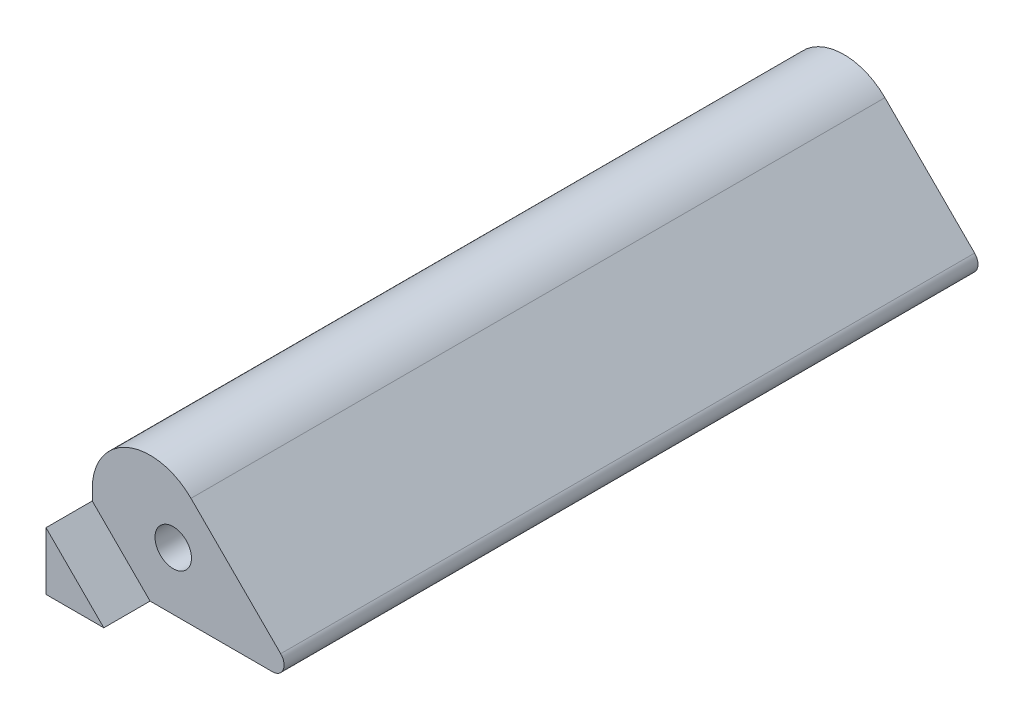
ISO-10303-21;
HEADER;
FILE_DESCRIPTION(('STEP AP214'),'2;1');
FILE_NAME('part.step','',(''),(''),'','','');
FILE_SCHEMA(('AUTOMOTIVE_DESIGN { 1 0 10303 214 1 1 1 1 }'));
ENDSEC;
DATA;
#1=APPLICATION_CONTEXT('core data for automotive mechanical design processes');
#2=APPLICATION_PROTOCOL_DEFINITION('international standard','automotive_design',2000,#1);
#3=PRODUCT_CONTEXT('',#1,'mechanical');
#4=PRODUCT('Part','Part','',(#3));
#5=PRODUCT_RELATED_PRODUCT_CATEGORY('part','',(#4));
#6=PRODUCT_DEFINITION_FORMATION('','',#4);
#7=PRODUCT_DEFINITION_CONTEXT('part definition',#1,'design');
#8=PRODUCT_DEFINITION('design','',#6,#7);
#9=PRODUCT_DEFINITION_SHAPE('','',#8);
#10=(LENGTH_UNIT() NAMED_UNIT(*) SI_UNIT(.MILLI.,.METRE.));
#11=(NAMED_UNIT(*) PLANE_ANGLE_UNIT() SI_UNIT($,.RADIAN.));
#12=(NAMED_UNIT(*) SI_UNIT($,.STERADIAN.) SOLID_ANGLE_UNIT());
#13=UNCERTAINTY_MEASURE_WITH_UNIT(LENGTH_MEASURE(1.E-05),#10,'distance_accuracy_value','');
#14=(GEOMETRIC_REPRESENTATION_CONTEXT(3) GLOBAL_UNCERTAINTY_ASSIGNED_CONTEXT((#13)) GLOBAL_UNIT_ASSIGNED_CONTEXT((#10,
#11,#12)) REPRESENTATION_CONTEXT('',''));
#15=CARTESIAN_POINT('',(0.,0.,0.));
#16=DIRECTION('',(0.,0.,1.));
#17=DIRECTION('',(1.,0.,0.));
#18=AXIS2_PLACEMENT_3D('',#15,#16,#17);
#19=CARTESIAN_POINT('',(0.,0.,0.));
#20=DIRECTION('',(0.,0.,1.));
#21=DIRECTION('',(1.,0.,0.));
#22=AXIS2_PLACEMENT_3D('',#19,#20,#21);
#23=PLANE('',#22);
#24=CARTESIAN_POINT('',(7.,5.,0.));
#25=DIRECTION('',(0.,0.,-1.));
#26=DIRECTION('',(-1.,0.,0.));
#27=AXIS2_PLACEMENT_3D('',#24,#25,#26);
#28=CIRCLE('',#27,1.57499999999999);
#29=CARTESIAN_POINT('',(5.42500000000001,5.,0.));
#30=VERTEX_POINT('',#29);
#31=EDGE_CURVE('E127',#30,#30,#28,.T.);
#32=ORIENTED_EDGE('',*,*,#31,.F.);
#33=EDGE_LOOP('',(#32));
#34=FACE_BOUND('',#33,.T.);
#35=DIRECTION('',(0.,-1.,0.));
#36=VECTOR('',#35,1.);
#37=CARTESIAN_POINT('',(0.,17.9999999999998,0.));
#38=LINE('',#37,#36);
#39=CARTESIAN_POINT('',(0.,5.92893218813442,0.));
#40=VERTEX_POINT('',#39);
#41=CARTESIAN_POINT('',(0.,5.,0.));
#42=VERTEX_POINT('',#41);
#43=EDGE_CURVE('E170',#40,#42,#38,.T.);
#44=ORIENTED_EDGE('',*,*,#43,.F.);
#45=CARTESIAN_POINT('',(5.,5.92893218813442,0.));
#46=DIRECTION('',(0.,0.,1.));
#47=DIRECTION('',(1.,0.,0.));
#48=AXIS2_PLACEMENT_3D('',#45,#46,#47);
#49=CIRCLE('',#48,5.);
#50=CARTESIAN_POINT('',(8.53553390593272,9.46446609406718,0.));
#51=VERTEX_POINT('',#50);
#52=EDGE_CURVE('E63',#40,#51,#49,.F.);
#53=ORIENTED_EDGE('',*,*,#52,.T.);
#54=DIRECTION('',(-0.707106781186551,0.707106781186544,0.));
#55=VECTOR('',#54,1.);
#56=CARTESIAN_POINT('',(18.,0.,0.));
#57=LINE('',#56,#55);
#58=CARTESIAN_POINT('',(16.2928932188134,1.70710678118655,0.));
#59=VERTEX_POINT('',#58);
#60=EDGE_CURVE('E174',#59,#51,#57,.T.);
#61=ORIENTED_EDGE('',*,*,#60,.F.);
#62=CARTESIAN_POINT('',(15.5857864376269,1.,0.));
#63=DIRECTION('',(0.,0.,1.));
#64=DIRECTION('',(1.,0.,0.));
#65=AXIS2_PLACEMENT_3D('',#62,#63,#64);
#66=CIRCLE('',#65,1.);
#67=CARTESIAN_POINT('',(15.5857864376269,0.,0.));
#68=VERTEX_POINT('',#67);
#69=EDGE_CURVE('E189',#59,#68,#66,.F.);
#70=ORIENTED_EDGE('',*,*,#69,.T.);
#71=DIRECTION('',(1.,0.,0.));
#72=VECTOR('',#71,1.);
#73=CARTESIAN_POINT('',(0.,0.,0.));
#74=LINE('',#73,#72);
#75=CARTESIAN_POINT('',(5.,0.,0.));
#76=VERTEX_POINT('',#75);
#77=EDGE_CURVE('E181',#76,#68,#74,.T.);
#78=ORIENTED_EDGE('',*,*,#77,.F.);
#79=DIRECTION('',(0.707106781186547,-0.707106781186548,0.));
#80=VECTOR('',#79,1.);
#81=CARTESIAN_POINT('',(0.,5.,0.));
#82=LINE('',#81,#80);
#83=EDGE_CURVE('E137',#42,#76,#82,.T.);
#84=ORIENTED_EDGE('',*,*,#83,.F.);
#85=EDGE_LOOP('',(#44,#53,#61,#70,#78,#84));
#86=FACE_BOUND('',#85,.T.);
#87=ADVANCED_FACE('F41',(#34,#86),#23,.F.);
#88=CARTESIAN_POINT('',(0.,17.9999999999998,60.));
#89=DIRECTION('',(1.,0.,0.));
#90=DIRECTION('',(0.,0.,-1.));
#91=AXIS2_PLACEMENT_3D('',#88,#89,#90);
#92=PLANE('',#91);
#93=DIRECTION('',(0.,-1.,0.));
#94=VECTOR('',#93,1.);
#95=CARTESIAN_POINT('',(0.,17.9999999999998,60.));
#96=LINE('',#95,#94);
#97=CARTESIAN_POINT('',(0.,5.92893218813442,60.));
#98=VERTEX_POINT('',#97);
#99=CARTESIAN_POINT('',(0.,5.,60.));
#100=VERTEX_POINT('',#99);
#101=EDGE_CURVE('E171',#98,#100,#96,.T.);
#102=ORIENTED_EDGE('',*,*,#101,.F.);
#103=DIRECTION('',(0.,0.,-1.));
#104=VECTOR('',#103,1.);
#105=CARTESIAN_POINT('',(0.,5.92893218813442,60.));
#106=LINE('',#105,#104);
#107=EDGE_CURVE('E195',#98,#40,#106,.T.);
#108=ORIENTED_EDGE('',*,*,#107,.T.);
#109=ORIENTED_EDGE('',*,*,#43,.T.);
#110=DIRECTION('',(0.,0.,1.));
#111=VECTOR('',#110,1.);
#112=CARTESIAN_POINT('',(0.,5.,-4.));
#113=LINE('',#112,#111);
#114=CARTESIAN_POINT('',(0.,5.,-4.));
#115=VERTEX_POINT('',#114);
#116=EDGE_CURVE('E150',#115,#42,#113,.T.);
#117=ORIENTED_EDGE('',*,*,#116,.F.);
#118=DIRECTION('',(0.,1.,0.));
#119=VECTOR('',#118,1.);
#120=CARTESIAN_POINT('',(0.,0.,-4.));
#121=LINE('',#120,#119);
#122=CARTESIAN_POINT('',(0.,0.,-4.));
#123=VERTEX_POINT('',#122);
#124=EDGE_CURVE('E141',#123,#115,#121,.T.);
#125=ORIENTED_EDGE('',*,*,#124,.F.);
#126=DIRECTION('',(0.,0.,-1.));
#127=VECTOR('',#126,1.);
#128=CARTESIAN_POINT('',(0.,0.,60.));
#129=LINE('',#128,#127);
#130=CARTESIAN_POINT('',(0.,0.,64.));
#131=VERTEX_POINT('',#130);
#132=EDGE_CURVE('E179',#131,#123,#129,.T.);
#133=ORIENTED_EDGE('',*,*,#132,.F.);
#134=DIRECTION('',(0.,-1.,0.));
#135=VECTOR('',#134,1.);
#136=CARTESIAN_POINT('',(0.,0.,64.));
#137=LINE('',#136,#135);
#138=CARTESIAN_POINT('',(0.,5.,64.));
#139=VERTEX_POINT('',#138);
#140=EDGE_CURVE('E159',#139,#131,#137,.T.);
#141=ORIENTED_EDGE('',*,*,#140,.F.);
#142=DIRECTION('',(0.,0.,-1.));
#143=VECTOR('',#142,1.);
#144=CARTESIAN_POINT('',(0.,5.,64.));
#145=LINE('',#144,#143);
#146=EDGE_CURVE('E162',#139,#100,#145,.T.);
#147=ORIENTED_EDGE('',*,*,#146,.T.);
#148=EDGE_LOOP('',(#102,#108,#109,#117,#125,#133,#141,#147));
#149=FACE_BOUND('',#148,.T.);
#150=ADVANCED_FACE('F201',(#149),#92,.F.);
#151=CARTESIAN_POINT('',(0.,0.,60.));
#152=DIRECTION('',(0.,1.,0.));
#153=DIRECTION('',(0.,0.,1.));
#154=AXIS2_PLACEMENT_3D('',#151,#152,#153);
#155=PLANE('',#154);
#156=ORIENTED_EDGE('',*,*,#77,.T.);
#157=DIRECTION('',(0.,0.,-1.));
#158=VECTOR('',#157,1.);
#159=CARTESIAN_POINT('',(15.5857864376269,0.,60.));
#160=LINE('',#159,#158);
#161=CARTESIAN_POINT('',(15.5857864376269,0.,60.));
#162=VERTEX_POINT('',#161);
#163=EDGE_CURVE('E191',#68,#162,#160,.F.);
#164=ORIENTED_EDGE('',*,*,#163,.T.);
#165=DIRECTION('',(1.,0.,0.));
#166=VECTOR('',#165,1.);
#167=CARTESIAN_POINT('',(0.,0.,60.));
#168=LINE('',#167,#166);
#169=CARTESIAN_POINT('',(5.,0.,60.));
#170=VERTEX_POINT('',#169);
#171=EDGE_CURVE('E173',#170,#162,#168,.T.);
#172=ORIENTED_EDGE('',*,*,#171,.F.);
#173=DIRECTION('',(0.,0.,-1.));
#174=VECTOR('',#173,1.);
#175=CARTESIAN_POINT('',(5.,0.,64.));
#176=LINE('',#175,#174);
#177=CARTESIAN_POINT('',(5.,0.,64.));
#178=VERTEX_POINT('',#177);
#179=EDGE_CURVE('E167',#178,#170,#176,.T.);
#180=ORIENTED_EDGE('',*,*,#179,.F.);
#181=DIRECTION('',(1.,0.,0.));
#182=VECTOR('',#181,1.);
#183=CARTESIAN_POINT('',(5.,0.,64.));
#184=LINE('',#183,#182);
#185=EDGE_CURVE('E154',#131,#178,#184,.T.);
#186=ORIENTED_EDGE('',*,*,#185,.F.);
#187=ORIENTED_EDGE('',*,*,#132,.T.);
#188=DIRECTION('',(-1.,0.,0.));
#189=VECTOR('',#188,1.);
#190=CARTESIAN_POINT('',(5.,0.,-4.));
#191=LINE('',#190,#189);
#192=CARTESIAN_POINT('',(5.,0.,-4.));
#193=VERTEX_POINT('',#192);
#194=EDGE_CURVE('E138',#193,#123,#191,.T.);
#195=ORIENTED_EDGE('',*,*,#194,.F.);
#196=DIRECTION('',(0.,0.,1.));
#197=VECTOR('',#196,1.);
#198=CARTESIAN_POINT('',(5.,0.,-4.));
#199=LINE('',#198,#197);
#200=EDGE_CURVE('E145',#193,#76,#199,.T.);
#201=ORIENTED_EDGE('',*,*,#200,.T.);
#202=EDGE_LOOP('',(#156,#164,#172,#180,#186,#187,#195,#201));
#203=FACE_BOUND('',#202,.T.);
#204=ADVANCED_FACE('F216',(#203),#155,.F.);
#205=CARTESIAN_POINT('',(18.,0.,60.));
#206=DIRECTION('',(-0.707106781186544,-0.707106781186551,0.));
#207=DIRECTION('',(0.707106781186551,-0.707106781186544,0.));
#208=AXIS2_PLACEMENT_3D('',#205,#206,#207);
#209=PLANE('',#208);
#210=ORIENTED_EDGE('',*,*,#60,.T.);
#211=DIRECTION('',(0.,0.,-1.));
#212=VECTOR('',#211,1.);
#213=CARTESIAN_POINT('',(8.53553390593272,9.46446609406718,60.));
#214=LINE('',#213,#212);
#215=CARTESIAN_POINT('',(8.53553390593272,9.46446609406718,60.));
#216=VERTEX_POINT('',#215);
#217=EDGE_CURVE('E49',#51,#216,#214,.F.);
#218=ORIENTED_EDGE('',*,*,#217,.T.);
#219=DIRECTION('',(-0.707106781186551,0.707106781186544,0.));
#220=VECTOR('',#219,1.);
#221=CARTESIAN_POINT('',(18.,0.,60.));
#222=LINE('',#221,#220);
#223=CARTESIAN_POINT('',(16.2928932188134,1.70710678118655,60.));
#224=VERTEX_POINT('',#223);
#225=EDGE_CURVE('E177',#224,#216,#222,.T.);
#226=ORIENTED_EDGE('',*,*,#225,.F.);
#227=DIRECTION('',(0.,0.,-1.));
#228=VECTOR('',#227,1.);
#229=CARTESIAN_POINT('',(16.2928932188134,1.70710678118655,60.));
#230=LINE('',#229,#228);
#231=EDGE_CURVE('E186',#224,#59,#230,.T.);
#232=ORIENTED_EDGE('',*,*,#231,.T.);
#233=EDGE_LOOP('',(#210,#218,#226,#232));
#234=FACE_BOUND('',#233,.T.);
#235=ADVANCED_FACE('F232',(#234),#209,.F.);
#236=CARTESIAN_POINT('',(0.,0.,60.));
#237=DIRECTION('',(0.,0.,1.));
#238=DIRECTION('',(1.,0.,0.));
#239=AXIS2_PLACEMENT_3D('',#236,#237,#238);
#240=PLANE('',#239);
#241=CARTESIAN_POINT('',(7.,5.,60.));
#242=DIRECTION('',(0.,0.,1.));
#243=DIRECTION('',(1.,0.,0.));
#244=AXIS2_PLACEMENT_3D('',#241,#242,#243);
#245=CIRCLE('',#244,1.57499999999999);
#246=CARTESIAN_POINT('',(8.57499999999999,5.,60.));
#247=VERTEX_POINT('',#246);
#248=EDGE_CURVE('E126',#247,#247,#245,.T.);
#249=ORIENTED_EDGE('',*,*,#248,.F.);
#250=EDGE_LOOP('',(#249));
#251=FACE_BOUND('',#250,.T.);
#252=ORIENTED_EDGE('',*,*,#225,.T.);
#253=CARTESIAN_POINT('',(5.,5.92893218813442,60.));
#254=DIRECTION('',(0.,0.,1.));
#255=DIRECTION('',(1.,0.,0.));
#256=AXIS2_PLACEMENT_3D('',#253,#254,#255);
#257=CIRCLE('',#256,5.);
#258=EDGE_CURVE('E11',#216,#98,#257,.T.);
#259=ORIENTED_EDGE('',*,*,#258,.T.);
#260=ORIENTED_EDGE('',*,*,#101,.T.);
#261=DIRECTION('',(-0.707106781186548,0.707106781186547,0.));
#262=VECTOR('',#261,1.);
#263=CARTESIAN_POINT('',(0.,5.,60.));
#264=LINE('',#263,#262);
#265=EDGE_CURVE('E153',#170,#100,#264,.T.);
#266=ORIENTED_EDGE('',*,*,#265,.F.);
#267=ORIENTED_EDGE('',*,*,#171,.T.);
#268=CARTESIAN_POINT('',(15.5857864376269,1.,60.));
#269=DIRECTION('',(0.,0.,1.));
#270=DIRECTION('',(1.,0.,0.));
#271=AXIS2_PLACEMENT_3D('',#268,#269,#270);
#272=CIRCLE('',#271,1.);
#273=EDGE_CURVE('E193',#162,#224,#272,.T.);
#274=ORIENTED_EDGE('',*,*,#273,.T.);
#275=EDGE_LOOP('',(#252,#259,#260,#266,#267,#274));
#276=FACE_BOUND('',#275,.T.);
#277=ADVANCED_FACE('F226',(#251,#276),#240,.T.);
#278=CARTESIAN_POINT('',(0.,5.,64.));
#279=DIRECTION('',(-0.707106781186547,-0.707106781186548,0.));
#280=DIRECTION('',(0.707106781186548,-0.707106781186547,0.));
#281=AXIS2_PLACEMENT_3D('',#278,#279,#280);
#282=PLANE('',#281);
#283=ORIENTED_EDGE('',*,*,#265,.T.);
#284=ORIENTED_EDGE('',*,*,#146,.F.);
#285=DIRECTION('',(-0.707106781186548,0.707106781186547,0.));
#286=VECTOR('',#285,1.);
#287=CARTESIAN_POINT('',(0.,5.,64.));
#288=LINE('',#287,#286);
#289=EDGE_CURVE('E157',#178,#139,#288,.T.);
#290=ORIENTED_EDGE('',*,*,#289,.F.);
#291=ORIENTED_EDGE('',*,*,#179,.T.);
#292=EDGE_LOOP('',(#283,#284,#290,#291));
#293=FACE_BOUND('',#292,.T.);
#294=ADVANCED_FACE('F224',(#293),#282,.F.);
#295=CARTESIAN_POINT('',(0.,0.,64.));
#296=DIRECTION('',(0.,0.,-1.));
#297=DIRECTION('',(-1.,0.,0.));
#298=AXIS2_PLACEMENT_3D('',#295,#296,#297);
#299=PLANE('',#298);
#300=ORIENTED_EDGE('',*,*,#185,.T.);
#301=ORIENTED_EDGE('',*,*,#289,.T.);
#302=ORIENTED_EDGE('',*,*,#140,.T.);
#303=EDGE_LOOP('',(#300,#301,#302));
#304=FACE_BOUND('',#303,.T.);
#305=ADVANCED_FACE('F221',(#304),#299,.F.);
#306=CARTESIAN_POINT('',(0.,5.,-4.));
#307=DIRECTION('',(-0.707106781186548,-0.707106781186547,0.));
#308=DIRECTION('',(0.707106781186547,-0.707106781186548,0.));
#309=AXIS2_PLACEMENT_3D('',#306,#307,#308);
#310=PLANE('',#309);
#311=ORIENTED_EDGE('',*,*,#83,.T.);
#312=ORIENTED_EDGE('',*,*,#200,.F.);
#313=DIRECTION('',(0.707106781186547,-0.707106781186548,0.));
#314=VECTOR('',#313,1.);
#315=CARTESIAN_POINT('',(0.,5.,-4.));
#316=LINE('',#315,#314);
#317=EDGE_CURVE('E143',#115,#193,#316,.T.);
#318=ORIENTED_EDGE('',*,*,#317,.F.);
#319=ORIENTED_EDGE('',*,*,#116,.T.);
#320=EDGE_LOOP('',(#311,#312,#318,#319));
#321=FACE_BOUND('',#320,.T.);
#322=ADVANCED_FACE('F209',(#321),#310,.F.);
#323=CARTESIAN_POINT('',(0.,0.,-4.));
#324=DIRECTION('',(0.,0.,-1.));
#325=DIRECTION('',(-1.,0.,0.));
#326=AXIS2_PLACEMENT_3D('',#323,#324,#325);
#327=PLANE('',#326);
#328=ORIENTED_EDGE('',*,*,#194,.T.);
#329=ORIENTED_EDGE('',*,*,#124,.T.);
#330=ORIENTED_EDGE('',*,*,#317,.T.);
#331=EDGE_LOOP('',(#328,#329,#330));
#332=FACE_BOUND('',#331,.T.);
#333=ADVANCED_FACE('F214',(#332),#327,.T.);
#334=CARTESIAN_POINT('',(7.,5.,50.));
#335=DIRECTION('',(0.,0.,1.));
#336=DIRECTION('',(1.,0.,0.));
#337=AXIS2_PLACEMENT_3D('',#334,#335,#336);
#338=CONICAL_SURFACE('',#337,1.575,1.02974425867665);
#339=CARTESIAN_POINT('',(7.,5.,49.0536445250316));
#340=VERTEX_POINT('',#339);
#341=VERTEX_LOOP('',#340);
#342=FACE_BOUND('',#341,.T.);
#343=CARTESIAN_POINT('',(7.,5.,50.));
#344=DIRECTION('',(0.,0.,1.));
#345=DIRECTION('',(1.,0.,0.));
#346=AXIS2_PLACEMENT_3D('',#343,#344,#345);
#347=CIRCLE('',#346,1.575);
#348=CARTESIAN_POINT('',(8.575,5.,50.));
#349=VERTEX_POINT('',#348);
#350=EDGE_CURVE('E130',#349,#349,#347,.T.);
#351=ORIENTED_EDGE('',*,*,#350,.T.);
#352=EDGE_LOOP('',(#351));
#353=FACE_BOUND('',#352,.T.);
#354=ADVANCED_FACE('F290',(#342,#353),#338,.F.);
#355=CARTESIAN_POINT('',(7.,5.,60.));
#356=DIRECTION('',(0.,0.,1.));
#357=DIRECTION('',(1.,0.,0.));
#358=AXIS2_PLACEMENT_3D('',#355,#356,#357);
#359=CYLINDRICAL_SURFACE('',#358,1.57499999999999);
#360=ORIENTED_EDGE('',*,*,#350,.F.);
#361=EDGE_LOOP('',(#360));
#362=FACE_BOUND('',#361,.T.);
#363=ORIENTED_EDGE('',*,*,#248,.T.);
#364=EDGE_LOOP('',(#363));
#365=FACE_BOUND('',#364,.T.);
#366=ADVANCED_FACE('F120',(#362,#365),#359,.F.);
#367=CARTESIAN_POINT('',(7.,5.,7.5));
#368=DIRECTION('',(0.,0.,-1.));
#369=DIRECTION('',(-1.,0.,0.));
#370=AXIS2_PLACEMENT_3D('',#367,#368,#369);
#371=CONICAL_SURFACE('',#370,1.575,1.02974425867665);
#372=CARTESIAN_POINT('',(7.,5.,8.44635547496841));
#373=VERTEX_POINT('',#372);
#374=VERTEX_LOOP('',#373);
#375=FACE_BOUND('',#374,.T.);
#376=CARTESIAN_POINT('',(7.,5.,7.5));
#377=DIRECTION('',(0.,0.,-1.));
#378=DIRECTION('',(-1.,0.,0.));
#379=AXIS2_PLACEMENT_3D('',#376,#377,#378);
#380=CIRCLE('',#379,1.575);
#381=CARTESIAN_POINT('',(5.425,5.,7.5));
#382=VERTEX_POINT('',#381);
#383=EDGE_CURVE('E124',#382,#382,#380,.T.);
#384=ORIENTED_EDGE('',*,*,#383,.T.);
#385=EDGE_LOOP('',(#384));
#386=FACE_BOUND('',#385,.T.);
#387=ADVANCED_FACE('F116',(#375,#386),#371,.F.);
#388=CARTESIAN_POINT('',(7.,5.,0.));
#389=DIRECTION('',(0.,0.,-1.));
#390=DIRECTION('',(-1.,0.,0.));
#391=AXIS2_PLACEMENT_3D('',#388,#389,#390);
#392=CYLINDRICAL_SURFACE('',#391,1.57499999999999);
#393=ORIENTED_EDGE('',*,*,#383,.F.);
#394=EDGE_LOOP('',(#393));
#395=FACE_BOUND('',#394,.T.);
#396=ORIENTED_EDGE('',*,*,#31,.T.);
#397=EDGE_LOOP('',(#396));
#398=FACE_BOUND('',#397,.T.);
#399=ADVANCED_FACE('F119',(#395,#398),#392,.F.);
#400=CARTESIAN_POINT('',(15.5857864376269,1.,60.));
#401=DIRECTION('',(0.,0.,-1.));
#402=DIRECTION('',(-1.,0.,0.));
#403=AXIS2_PLACEMENT_3D('',#400,#401,#402);
#404=CYLINDRICAL_SURFACE('',#403,1.);
#405=ORIENTED_EDGE('',*,*,#273,.F.);
#406=ORIENTED_EDGE('',*,*,#163,.F.);
#407=ORIENTED_EDGE('',*,*,#69,.F.);
#408=ORIENTED_EDGE('',*,*,#231,.F.);
#409=EDGE_LOOP('',(#405,#406,#407,#408));
#410=FACE_BOUND('',#409,.T.);
#411=ADVANCED_FACE('F230',(#410),#404,.T.);
#412=CARTESIAN_POINT('',(5.,5.92893218813442,60.));
#413=DIRECTION('',(0.,0.,-1.));
#414=DIRECTION('',(-1.,0.,0.));
#415=AXIS2_PLACEMENT_3D('',#412,#413,#414);
#416=CYLINDRICAL_SURFACE('',#415,5.);
#417=ORIENTED_EDGE('',*,*,#258,.F.);
#418=ORIENTED_EDGE('',*,*,#217,.F.);
#419=ORIENTED_EDGE('',*,*,#52,.F.);
#420=ORIENTED_EDGE('',*,*,#107,.F.);
#421=EDGE_LOOP('',(#417,#418,#419,#420));
#422=FACE_BOUND('',#421,.T.);
#423=ADVANCED_FACE('F43',(#422),#416,.T.);
#424=CLOSED_SHELL('',(#87,#150,#204,#235,#277,#294,#305,#322,#333,#354,#366,#387,#399,#411,#423));
#425=MANIFOLD_SOLID_BREP('B2',#424);
#426=ADVANCED_BREP_SHAPE_REPRESENTATION('',(#18,#425),#14);
#427=SHAPE_DEFINITION_REPRESENTATION(#9,#426);
ENDSEC;
END-ISO-10303-21;
